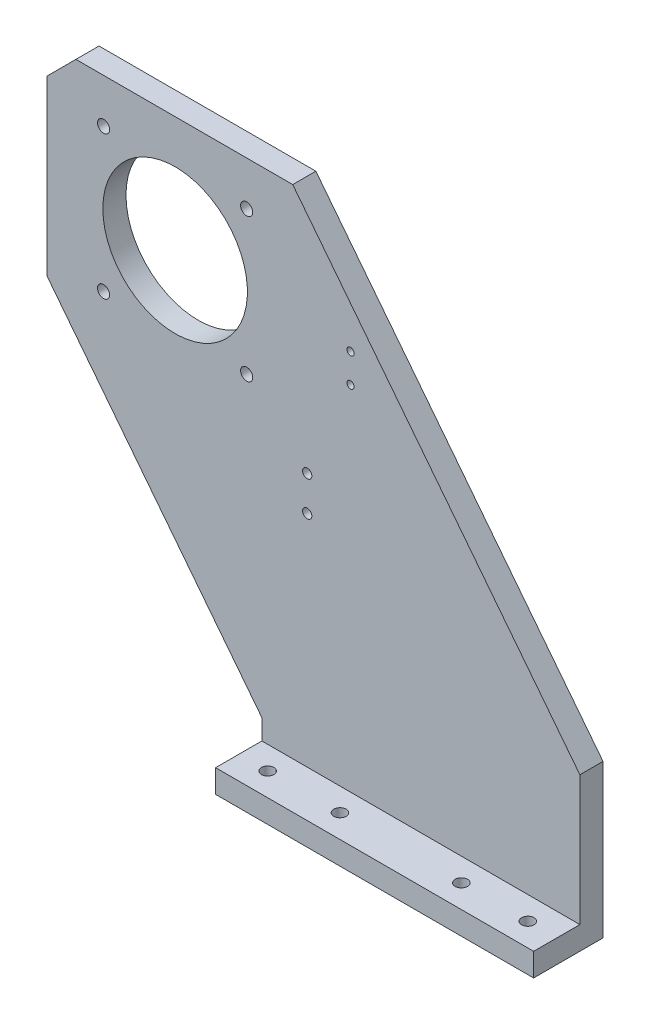
ISO-10303-21;
HEADER;
FILE_DESCRIPTION(('STEP AP214'),'2;1');
FILE_NAME('part.step','',(''),(''),'','','');
FILE_SCHEMA(('AUTOMOTIVE_DESIGN { 1 0 10303 214 1 1 1 1 }'));
ENDSEC;
DATA;
#1=APPLICATION_CONTEXT('core data for automotive mechanical design processes');
#2=APPLICATION_PROTOCOL_DEFINITION('international standard','automotive_design',2000,#1);
#3=PRODUCT_CONTEXT('',#1,'mechanical');
#4=PRODUCT('Part','Part','',(#3));
#5=PRODUCT_RELATED_PRODUCT_CATEGORY('part','',(#4));
#6=PRODUCT_DEFINITION_FORMATION('','',#4);
#7=PRODUCT_DEFINITION_CONTEXT('part definition',#1,'design');
#8=PRODUCT_DEFINITION('design','',#6,#7);
#9=PRODUCT_DEFINITION_SHAPE('','',#8);
#10=(LENGTH_UNIT() NAMED_UNIT(*) SI_UNIT(.MILLI.,.METRE.));
#11=(NAMED_UNIT(*) PLANE_ANGLE_UNIT() SI_UNIT($,.RADIAN.));
#12=(NAMED_UNIT(*) SI_UNIT($,.STERADIAN.) SOLID_ANGLE_UNIT());
#13=UNCERTAINTY_MEASURE_WITH_UNIT(LENGTH_MEASURE(1.E-05),#10,'distance_accuracy_value','');
#14=(GEOMETRIC_REPRESENTATION_CONTEXT(3) GLOBAL_UNCERTAINTY_ASSIGNED_CONTEXT((#13)) GLOBAL_UNIT_ASSIGNED_CONTEXT((#10,
#11,#12)) REPRESENTATION_CONTEXT('',''));
#15=CARTESIAN_POINT('',(0.,0.,0.));
#16=DIRECTION('',(0.,0.,1.));
#17=DIRECTION('',(1.,0.,0.));
#18=AXIS2_PLACEMENT_3D('',#15,#16,#17);
#19=CARTESIAN_POINT('',(35.,0.,16.));
#20=DIRECTION('',(0.,1.,0.));
#21=DIRECTION('',(0.,0.,1.));
#22=AXIS2_PLACEMENT_3D('',#19,#20,#21);
#23=CYLINDRICAL_SURFACE('',#22,2.15);
#24=CARTESIAN_POINT('',(35.,0.,16.));
#25=DIRECTION('',(0.,1.,0.));
#26=DIRECTION('',(0.,0.,1.));
#27=AXIS2_PLACEMENT_3D('',#24,#25,#26);
#28=CIRCLE('',#27,2.15);
#29=CARTESIAN_POINT('',(35.,0.,18.15));
#30=VERTEX_POINT('',#29);
#31=EDGE_CURVE('E163',#30,#30,#28,.F.);
#32=ORIENTED_EDGE('',*,*,#31,.T.);
#33=EDGE_LOOP('',(#32));
#34=FACE_BOUND('',#33,.T.);
#35=CARTESIAN_POINT('',(35.,8.,16.));
#36=DIRECTION('',(0.,1.,0.));
#37=DIRECTION('',(0.,0.,1.));
#38=AXIS2_PLACEMENT_3D('',#35,#36,#37);
#39=CIRCLE('',#38,2.15);
#40=CARTESIAN_POINT('',(35.,8.,18.15));
#41=VERTEX_POINT('',#40);
#42=EDGE_CURVE('E19',#41,#41,#39,.T.);
#43=ORIENTED_EDGE('',*,*,#42,.T.);
#44=EDGE_LOOP('',(#43));
#45=FACE_BOUND('',#44,.T.);
#46=ADVANCED_FACE('F16',(#34,#45),#23,.F.);
#47=CARTESIAN_POINT('',(100.,0.,16.));
#48=DIRECTION('',(0.,1.,0.));
#49=DIRECTION('',(0.,0.,1.));
#50=AXIS2_PLACEMENT_3D('',#47,#48,#49);
#51=CYLINDRICAL_SURFACE('',#50,2.15);
#52=CARTESIAN_POINT('',(100.,0.,16.));
#53=DIRECTION('',(0.,1.,0.));
#54=DIRECTION('',(0.,0.,1.));
#55=AXIS2_PLACEMENT_3D('',#52,#53,#54);
#56=CIRCLE('',#55,2.15);
#57=CARTESIAN_POINT('',(100.,0.,18.15));
#58=VERTEX_POINT('',#57);
#59=EDGE_CURVE('E160',#58,#58,#56,.F.);
#60=ORIENTED_EDGE('',*,*,#59,.T.);
#61=EDGE_LOOP('',(#60));
#62=FACE_BOUND('',#61,.T.);
#63=CARTESIAN_POINT('',(100.,8.,16.));
#64=DIRECTION('',(0.,1.,0.));
#65=DIRECTION('',(0.,0.,1.));
#66=AXIS2_PLACEMENT_3D('',#63,#64,#65);
#67=CIRCLE('',#66,2.15);
#68=CARTESIAN_POINT('',(100.,8.,18.15));
#69=VERTEX_POINT('',#68);
#70=EDGE_CURVE('E193',#69,#69,#67,.T.);
#71=ORIENTED_EDGE('',*,*,#70,.T.);
#72=EDGE_LOOP('',(#71));
#73=FACE_BOUND('',#72,.T.);
#74=ADVANCED_FACE('F437',(#62,#73),#51,.F.);
#75=CARTESIAN_POINT('',(77.,0.,16.));
#76=DIRECTION('',(0.,1.,0.));
#77=DIRECTION('',(0.,0.,1.));
#78=AXIS2_PLACEMENT_3D('',#75,#76,#77);
#79=CYLINDRICAL_SURFACE('',#78,2.15);
#80=CARTESIAN_POINT('',(77.,0.,16.));
#81=DIRECTION('',(0.,1.,0.));
#82=DIRECTION('',(0.,0.,1.));
#83=AXIS2_PLACEMENT_3D('',#80,#81,#82);
#84=CIRCLE('',#83,2.15);
#85=CARTESIAN_POINT('',(77.,0.,18.15));
#86=VERTEX_POINT('',#85);
#87=EDGE_CURVE('E157',#86,#86,#84,.F.);
#88=ORIENTED_EDGE('',*,*,#87,.T.);
#89=EDGE_LOOP('',(#88));
#90=FACE_BOUND('',#89,.T.);
#91=CARTESIAN_POINT('',(77.,8.,16.));
#92=DIRECTION('',(0.,1.,0.));
#93=DIRECTION('',(0.,0.,1.));
#94=AXIS2_PLACEMENT_3D('',#91,#92,#93);
#95=CIRCLE('',#94,2.15);
#96=CARTESIAN_POINT('',(77.,8.,18.15));
#97=VERTEX_POINT('',#96);
#98=EDGE_CURVE('E191',#97,#97,#95,.T.);
#99=ORIENTED_EDGE('',*,*,#98,.T.);
#100=EDGE_LOOP('',(#99));
#101=FACE_BOUND('',#100,.T.);
#102=ADVANCED_FACE('F428',(#90,#101),#79,.F.);
#103=CARTESIAN_POINT('',(10.,0.,16.));
#104=DIRECTION('',(0.,1.,0.));
#105=DIRECTION('',(0.,0.,1.));
#106=AXIS2_PLACEMENT_3D('',#103,#104,#105);
#107=CYLINDRICAL_SURFACE('',#106,2.15);
#108=CARTESIAN_POINT('',(10.,0.,16.));
#109=DIRECTION('',(0.,1.,0.));
#110=DIRECTION('',(0.,0.,1.));
#111=AXIS2_PLACEMENT_3D('',#108,#109,#110);
#112=CIRCLE('',#111,2.15);
#113=CARTESIAN_POINT('',(10.,0.,18.15));
#114=VERTEX_POINT('',#113);
#115=EDGE_CURVE('E153',#114,#114,#112,.F.);
#116=ORIENTED_EDGE('',*,*,#115,.T.);
#117=EDGE_LOOP('',(#116));
#118=FACE_BOUND('',#117,.T.);
#119=CARTESIAN_POINT('',(10.,8.,16.));
#120=DIRECTION('',(0.,1.,0.));
#121=DIRECTION('',(0.,0.,1.));
#122=AXIS2_PLACEMENT_3D('',#119,#120,#121);
#123=CIRCLE('',#122,2.15);
#124=CARTESIAN_POINT('',(10.,8.,18.15));
#125=VERTEX_POINT('',#124);
#126=EDGE_CURVE('E123',#125,#125,#123,.T.);
#127=ORIENTED_EDGE('',*,*,#126,.T.);
#128=EDGE_LOOP('',(#127));
#129=FACE_BOUND('',#128,.T.);
#130=ADVANCED_FACE('F214',(#118,#129),#107,.F.);
#131=CARTESIAN_POINT('',(0.,0.,24.));
#132=DIRECTION('',(0.,0.,-1.));
#133=DIRECTION('',(-1.,0.,0.));
#134=AXIS2_PLACEMENT_3D('',#131,#132,#133);
#135=PLANE('',#134);
#136=DIRECTION('',(1.,0.,0.));
#137=VECTOR('',#136,1.);
#138=CARTESIAN_POINT('',(0.,0.,24.));
#139=LINE('',#138,#137);
#140=CARTESIAN_POINT('',(0.,0.,24.));
#141=VERTEX_POINT('',#140);
#142=CARTESIAN_POINT('',(110.,0.,24.));
#143=VERTEX_POINT('',#142);
#144=EDGE_CURVE('E521',#141,#143,#139,.T.);
#145=ORIENTED_EDGE('',*,*,#144,.T.);
#146=DIRECTION('',(0.,1.,0.));
#147=VECTOR('',#146,1.);
#148=CARTESIAN_POINT('',(110.,0.,24.));
#149=LINE('',#148,#147);
#150=CARTESIAN_POINT('',(110.,8.,24.));
#151=VERTEX_POINT('',#150);
#152=EDGE_CURVE('E538',#143,#151,#149,.T.);
#153=ORIENTED_EDGE('',*,*,#152,.T.);
#154=DIRECTION('',(1.,0.,0.));
#155=VECTOR('',#154,1.);
#156=CARTESIAN_POINT('',(0.,8.,24.));
#157=LINE('',#156,#155);
#158=CARTESIAN_POINT('',(0.,8.,24.));
#159=VERTEX_POINT('',#158);
#160=EDGE_CURVE('E122',#151,#159,#157,.F.);
#161=ORIENTED_EDGE('',*,*,#160,.T.);
#162=DIRECTION('',(0.,1.,0.));
#163=VECTOR('',#162,1.);
#164=CARTESIAN_POINT('',(0.,15.,24.));
#165=LINE('',#164,#163);
#166=EDGE_CURVE('E166',#159,#141,#165,.F.);
#167=ORIENTED_EDGE('',*,*,#166,.T.);
#168=EDGE_LOOP('',(#145,#153,#161,#167));
#169=FACE_BOUND('',#168,.T.);
#170=ADVANCED_FACE('F203',(#169),#135,.F.);
#171=CARTESIAN_POINT('',(0.,8.,24.));
#172=DIRECTION('',(0.,-1.,0.));
#173=DIRECTION('',(0.,0.,-1.));
#174=AXIS2_PLACEMENT_3D('',#171,#172,#173);
#175=PLANE('',#174);
#176=DIRECTION('',(0.,0.,1.));
#177=VECTOR('',#176,1.);
#178=CARTESIAN_POINT('',(0.,8.,8.));
#179=LINE('',#178,#177);
#180=CARTESIAN_POINT('',(0.,8.,8.));
#181=VERTEX_POINT('',#180);
#182=EDGE_CURVE('E528',#181,#159,#179,.T.);
#183=ORIENTED_EDGE('',*,*,#182,.T.);
#184=ORIENTED_EDGE('',*,*,#160,.F.);
#185=DIRECTION('',(0.,0.,1.));
#186=VECTOR('',#185,1.);
#187=CARTESIAN_POINT('',(110.,8.,8.));
#188=LINE('',#187,#186);
#189=CARTESIAN_POINT('',(110.,8.,8.));
#190=VERTEX_POINT('',#189);
#191=EDGE_CURVE('E534',#151,#190,#188,.F.);
#192=ORIENTED_EDGE('',*,*,#191,.T.);
#193=DIRECTION('',(1.,0.,0.));
#194=VECTOR('',#193,1.);
#195=CARTESIAN_POINT('',(0.,8.,8.));
#196=LINE('',#195,#194);
#197=EDGE_CURVE('E119',#181,#190,#196,.T.);
#198=ORIENTED_EDGE('',*,*,#197,.F.);
#199=EDGE_LOOP('',(#183,#184,#192,#198));
#200=FACE_BOUND('',#199,.T.);
#201=ORIENTED_EDGE('',*,*,#126,.F.);
#202=EDGE_LOOP('',(#201));
#203=FACE_BOUND('',#202,.T.);
#204=ORIENTED_EDGE('',*,*,#98,.F.);
#205=EDGE_LOOP('',(#204));
#206=FACE_BOUND('',#205,.T.);
#207=ORIENTED_EDGE('',*,*,#70,.F.);
#208=EDGE_LOOP('',(#207));
#209=FACE_BOUND('',#208,.T.);
#210=ORIENTED_EDGE('',*,*,#42,.F.);
#211=EDGE_LOOP('',(#210));
#212=FACE_BOUND('',#211,.T.);
#213=ADVANCED_FACE('F201',(#200,#203,#206,#209,#212),#175,.F.);
#214=CARTESIAN_POINT('',(0.,0.,8.));
#215=DIRECTION('',(0.,0.,1.));
#216=DIRECTION('',(1.,0.,0.));
#217=AXIS2_PLACEMENT_3D('',#214,#215,#216);
#218=PLANE('',#217);
#219=CARTESIAN_POINT('',(-30.,140.,8.));
#220=DIRECTION('',(0.,0.,-1.));
#221=DIRECTION('',(-1.,0.,0.));
#222=AXIS2_PLACEMENT_3D('',#219,#220,#221);
#223=CIRCLE('',#222,24.9999999999983);
#224=CARTESIAN_POINT('',(-54.9999999999983,140.,8.));
#225=VERTEX_POINT('',#224);
#226=EDGE_CURVE('E149',#225,#225,#223,.T.);
#227=ORIENTED_EDGE('',*,*,#226,.T.);
#228=EDGE_LOOP('',(#227));
#229=FACE_BOUND('',#228,.T.);
#230=DIRECTION('',(-0.615661475325657,0.788010753606723,0.));
#231=VECTOR('',#230,1.);
#232=CARTESIAN_POINT('',(-74.3201247156244,110.12542173331,8.));
#233=LINE('',#232,#231);
#234=CARTESIAN_POINT('',(-74.3201247156244,110.12542173331,8.));
#235=VERTEX_POINT('',#234);
#236=CARTESIAN_POINT('',(0.,15.,8.));
#237=VERTEX_POINT('',#236);
#238=EDGE_CURVE('E92',#235,#237,#233,.F.);
#239=ORIENTED_EDGE('',*,*,#238,.T.);
#240=DIRECTION('',(0.,1.,0.));
#241=VECTOR('',#240,1.);
#242=CARTESIAN_POINT('',(0.,15.,8.));
#243=LINE('',#242,#241);
#244=EDGE_CURVE('E530',#237,#181,#243,.F.);
#245=ORIENTED_EDGE('',*,*,#244,.T.);
#246=ORIENTED_EDGE('',*,*,#197,.T.);
#247=DIRECTION('',(0.,1.,0.));
#248=VECTOR('',#247,1.);
#249=CARTESIAN_POINT('',(110.,0.,8.));
#250=LINE('',#249,#248);
#251=CARTESIAN_POINT('',(110.,52.8760374618631,8.));
#252=VERTEX_POINT('',#251);
#253=EDGE_CURVE('E537',#190,#252,#250,.T.);
#254=ORIENTED_EDGE('',*,*,#253,.T.);
#255=DIRECTION('',(0.615661475325657,-0.788010753606723,0.));
#256=VECTOR('',#255,1.);
#257=CARTESIAN_POINT('',(110.,52.8760374618631,8.));
#258=LINE('',#257,#256);
#259=CARTESIAN_POINT('',(10.6798752843756,180.,8.));
#260=VERTEX_POINT('',#259);
#261=EDGE_CURVE('E572',#252,#260,#258,.F.);
#262=ORIENTED_EDGE('',*,*,#261,.T.);
#263=DIRECTION('',(1.,0.,0.));
#264=VECTOR('',#263,1.);
#265=CARTESIAN_POINT('',(10.6798752843756,180.,8.));
#266=LINE('',#265,#264);
#267=CARTESIAN_POINT('',(-64.3201247156244,180.,8.));
#268=VERTEX_POINT('',#267);
#269=EDGE_CURVE('E567',#260,#268,#266,.F.);
#270=ORIENTED_EDGE('',*,*,#269,.T.);
#271=DIRECTION('',(0.707106781186548,0.707106781186548,0.));
#272=VECTOR('',#271,1.);
#273=CARTESIAN_POINT('',(-64.3201247156244,180.,8.));
#274=LINE('',#273,#272);
#275=CARTESIAN_POINT('',(-74.3201247156244,170.,8.));
#276=VERTEX_POINT('',#275);
#277=EDGE_CURVE('E98',#268,#276,#274,.F.);
#278=ORIENTED_EDGE('',*,*,#277,.T.);
#279=DIRECTION('',(0.,1.,0.));
#280=VECTOR('',#279,1.);
#281=CARTESIAN_POINT('',(-74.3201247156244,170.,8.));
#282=LINE('',#281,#280);
#283=EDGE_CURVE('E95',#276,#235,#282,.F.);
#284=ORIENTED_EDGE('',*,*,#283,.T.);
#285=EDGE_LOOP('',(#239,#245,#246,#254,#262,#270,#278,#284));
#286=FACE_BOUND('',#285,.T.);
#287=CARTESIAN_POINT('',(-5.25000000000002,115.25,8.));
#288=DIRECTION('',(0.,0.,1.));
#289=DIRECTION('',(1.,0.,0.));
#290=AXIS2_PLACEMENT_3D('',#287,#288,#289);
#291=CIRCLE('',#290,2.09999999999999);
#292=CARTESIAN_POINT('',(-3.15000000000003,115.25,8.));
#293=VERTEX_POINT('',#292);
#294=EDGE_CURVE('E104',#293,#293,#291,.F.);
#295=ORIENTED_EDGE('',*,*,#294,.T.);
#296=EDGE_LOOP('',(#295));
#297=FACE_BOUND('',#296,.T.);
#298=CARTESIAN_POINT('',(-54.75,115.25,8.));
#299=DIRECTION('',(0.,0.,1.));
#300=DIRECTION('',(1.,0.,0.));
#301=AXIS2_PLACEMENT_3D('',#298,#299,#300);
#302=CIRCLE('',#301,2.09999999999999);
#303=CARTESIAN_POINT('',(-52.65,115.25,8.));
#304=VERTEX_POINT('',#303);
#305=EDGE_CURVE('E169',#304,#304,#302,.F.);
#306=ORIENTED_EDGE('',*,*,#305,.T.);
#307=EDGE_LOOP('',(#306));
#308=FACE_BOUND('',#307,.T.);
#309=CARTESIAN_POINT('',(-5.25000000000002,164.75,8.));
#310=DIRECTION('',(0.,0.,1.));
#311=DIRECTION('',(1.,0.,0.));
#312=AXIS2_PLACEMENT_3D('',#309,#310,#311);
#313=CIRCLE('',#312,2.09999999999999);
#314=CARTESIAN_POINT('',(-3.15000000000003,164.75,8.));
#315=VERTEX_POINT('',#314);
#316=EDGE_CURVE('E172',#315,#315,#313,.F.);
#317=ORIENTED_EDGE('',*,*,#316,.T.);
#318=EDGE_LOOP('',(#317));
#319=FACE_BOUND('',#318,.T.);
#320=CARTESIAN_POINT('',(-54.75,164.75,8.));
#321=DIRECTION('',(0.,0.,1.));
#322=DIRECTION('',(1.,0.,0.));
#323=AXIS2_PLACEMENT_3D('',#320,#321,#322);
#324=CIRCLE('',#323,2.09999999999999);
#325=CARTESIAN_POINT('',(-52.65,164.75,8.));
#326=VERTEX_POINT('',#325);
#327=EDGE_CURVE('E175',#326,#326,#324,.F.);
#328=ORIENTED_EDGE('',*,*,#327,.T.);
#329=EDGE_LOOP('',(#328));
#330=FACE_BOUND('',#329,.T.);
#331=CARTESIAN_POINT('',(15.6798752843756,96.,8.));
#332=DIRECTION('',(0.,0.,1.));
#333=DIRECTION('',(1.,0.,0.));
#334=AXIS2_PLACEMENT_3D('',#331,#332,#333);
#335=CIRCLE('',#334,1.60000000000001);
#336=CARTESIAN_POINT('',(17.2798752843756,96.,8.));
#337=VERTEX_POINT('',#336);
#338=EDGE_CURVE('E178',#337,#337,#335,.F.);
#339=ORIENTED_EDGE('',*,*,#338,.T.);
#340=EDGE_LOOP('',(#339));
#341=FACE_BOUND('',#340,.T.);
#342=CARTESIAN_POINT('',(15.6798752843756,84.,8.));
#343=DIRECTION('',(0.,0.,1.));
#344=DIRECTION('',(1.,0.,0.));
#345=AXIS2_PLACEMENT_3D('',#342,#343,#344);
#346=CIRCLE('',#345,1.60000000000001);
#347=CARTESIAN_POINT('',(17.2798752843756,84.,8.));
#348=VERTEX_POINT('',#347);
#349=EDGE_CURVE('E181',#348,#348,#346,.F.);
#350=ORIENTED_EDGE('',*,*,#349,.T.);
#351=EDGE_LOOP('',(#350));
#352=FACE_BOUND('',#351,.T.);
#353=CARTESIAN_POINT('',(30.6798752843756,140.,8.));
#354=DIRECTION('',(0.,0.,1.));
#355=DIRECTION('',(1.,0.,0.));
#356=AXIS2_PLACEMENT_3D('',#353,#354,#355);
#357=CIRCLE('',#356,1.25);
#358=CARTESIAN_POINT('',(31.9298752843756,140.,8.));
#359=VERTEX_POINT('',#358);
#360=EDGE_CURVE('E184',#359,#359,#357,.F.);
#361=ORIENTED_EDGE('',*,*,#360,.T.);
#362=EDGE_LOOP('',(#361));
#363=FACE_BOUND('',#362,.T.);
#364=CARTESIAN_POINT('',(30.6798752843756,130.,8.));
#365=DIRECTION('',(0.,0.,1.));
#366=DIRECTION('',(1.,0.,0.));
#367=AXIS2_PLACEMENT_3D('',#364,#365,#366);
#368=CIRCLE('',#367,1.25);
#369=CARTESIAN_POINT('',(31.9298752843756,130.,8.));
#370=VERTEX_POINT('',#369);
#371=EDGE_CURVE('E121',#370,#370,#368,.F.);
#372=ORIENTED_EDGE('',*,*,#371,.T.);
#373=EDGE_LOOP('',(#372));
#374=FACE_BOUND('',#373,.T.);
#375=ADVANCED_FACE('F96',(#229,#286,#297,#308,#319,#330,#341,#352,#363,#374),#218,.T.);
#376=CARTESIAN_POINT('',(30.6798752843756,130.,8.));
#377=DIRECTION('',(0.,0.,1.));
#378=DIRECTION('',(1.,0.,0.));
#379=AXIS2_PLACEMENT_3D('',#376,#377,#378);
#380=CYLINDRICAL_SURFACE('',#379,1.25);
#381=CARTESIAN_POINT('',(30.6798752843756,130.,0.));
#382=DIRECTION('',(0.,0.,1.));
#383=DIRECTION('',(1.,0.,0.));
#384=AXIS2_PLACEMENT_3D('',#381,#382,#383);
#385=CIRCLE('',#384,1.25);
#386=CARTESIAN_POINT('',(31.9298752843756,130.,0.));
#387=VERTEX_POINT('',#386);
#388=EDGE_CURVE('E146',#387,#387,#385,.F.);
#389=ORIENTED_EDGE('',*,*,#388,.T.);
#390=EDGE_LOOP('',(#389));
#391=FACE_BOUND('',#390,.T.);
#392=ORIENTED_EDGE('',*,*,#371,.F.);
#393=EDGE_LOOP('',(#392));
#394=FACE_BOUND('',#393,.T.);
#395=ADVANCED_FACE('F211',(#391,#394),#380,.F.);
#396=CARTESIAN_POINT('',(30.6798752843756,140.,8.));
#397=DIRECTION('',(0.,0.,1.));
#398=DIRECTION('',(1.,0.,0.));
#399=AXIS2_PLACEMENT_3D('',#396,#397,#398);
#400=CYLINDRICAL_SURFACE('',#399,1.25);
#401=CARTESIAN_POINT('',(30.6798752843756,140.,0.));
#402=DIRECTION('',(0.,0.,1.));
#403=DIRECTION('',(1.,0.,0.));
#404=AXIS2_PLACEMENT_3D('',#401,#402,#403);
#405=CIRCLE('',#404,1.25);
#406=CARTESIAN_POINT('',(31.9298752843756,140.,0.));
#407=VERTEX_POINT('',#406);
#408=EDGE_CURVE('E143',#407,#407,#405,.F.);
#409=ORIENTED_EDGE('',*,*,#408,.T.);
#410=EDGE_LOOP('',(#409));
#411=FACE_BOUND('',#410,.T.);
#412=ORIENTED_EDGE('',*,*,#360,.F.);
#413=EDGE_LOOP('',(#412));
#414=FACE_BOUND('',#413,.T.);
#415=ADVANCED_FACE('F282',(#411,#414),#400,.F.);
#416=CARTESIAN_POINT('',(15.6798752843756,84.,0.));
#417=DIRECTION('',(0.,0.,1.));
#418=DIRECTION('',(1.,0.,0.));
#419=AXIS2_PLACEMENT_3D('',#416,#417,#418);
#420=CYLINDRICAL_SURFACE('',#419,1.60000000000001);
#421=CARTESIAN_POINT('',(15.6798752843756,84.,0.));
#422=DIRECTION('',(0.,0.,1.));
#423=DIRECTION('',(1.,0.,0.));
#424=AXIS2_PLACEMENT_3D('',#421,#422,#423);
#425=CIRCLE('',#424,1.60000000000001);
#426=CARTESIAN_POINT('',(17.2798752843756,84.,0.));
#427=VERTEX_POINT('',#426);
#428=EDGE_CURVE('E140',#427,#427,#425,.F.);
#429=ORIENTED_EDGE('',*,*,#428,.T.);
#430=EDGE_LOOP('',(#429));
#431=FACE_BOUND('',#430,.T.);
#432=ORIENTED_EDGE('',*,*,#349,.F.);
#433=EDGE_LOOP('',(#432));
#434=FACE_BOUND('',#433,.T.);
#435=ADVANCED_FACE('F278',(#431,#434),#420,.F.);
#436=CARTESIAN_POINT('',(15.6798752843756,96.,0.));
#437=DIRECTION('',(0.,0.,1.));
#438=DIRECTION('',(1.,0.,0.));
#439=AXIS2_PLACEMENT_3D('',#436,#437,#438);
#440=CYLINDRICAL_SURFACE('',#439,1.60000000000001);
#441=CARTESIAN_POINT('',(15.6798752843756,96.,0.));
#442=DIRECTION('',(0.,0.,1.));
#443=DIRECTION('',(1.,0.,0.));
#444=AXIS2_PLACEMENT_3D('',#441,#442,#443);
#445=CIRCLE('',#444,1.60000000000001);
#446=CARTESIAN_POINT('',(17.2798752843756,96.,0.));
#447=VERTEX_POINT('',#446);
#448=EDGE_CURVE('E137',#447,#447,#445,.F.);
#449=ORIENTED_EDGE('',*,*,#448,.T.);
#450=EDGE_LOOP('',(#449));
#451=FACE_BOUND('',#450,.T.);
#452=ORIENTED_EDGE('',*,*,#338,.F.);
#453=EDGE_LOOP('',(#452));
#454=FACE_BOUND('',#453,.T.);
#455=ADVANCED_FACE('F274',(#451,#454),#440,.F.);
#456=CARTESIAN_POINT('',(-54.75,164.75,8.));
#457=DIRECTION('',(0.,0.,1.));
#458=DIRECTION('',(1.,0.,0.));
#459=AXIS2_PLACEMENT_3D('',#456,#457,#458);
#460=CYLINDRICAL_SURFACE('',#459,2.09999999999999);
#461=CARTESIAN_POINT('',(-54.75,164.75,0.));
#462=DIRECTION('',(0.,0.,1.));
#463=DIRECTION('',(1.,0.,0.));
#464=AXIS2_PLACEMENT_3D('',#461,#462,#463);
#465=CIRCLE('',#464,2.09999999999999);
#466=CARTESIAN_POINT('',(-52.65,164.75,0.));
#467=VERTEX_POINT('',#466);
#468=EDGE_CURVE('E134',#467,#467,#465,.F.);
#469=ORIENTED_EDGE('',*,*,#468,.T.);
#470=EDGE_LOOP('',(#469));
#471=FACE_BOUND('',#470,.T.);
#472=ORIENTED_EDGE('',*,*,#327,.F.);
#473=EDGE_LOOP('',(#472));
#474=FACE_BOUND('',#473,.T.);
#475=ADVANCED_FACE('F270',(#471,#474),#460,.F.);
#476=CARTESIAN_POINT('',(-5.25000000000002,164.75,8.));
#477=DIRECTION('',(0.,0.,1.));
#478=DIRECTION('',(1.,0.,0.));
#479=AXIS2_PLACEMENT_3D('',#476,#477,#478);
#480=CYLINDRICAL_SURFACE('',#479,2.09999999999999);
#481=CARTESIAN_POINT('',(-5.25000000000002,164.75,0.));
#482=DIRECTION('',(0.,0.,1.));
#483=DIRECTION('',(1.,0.,0.));
#484=AXIS2_PLACEMENT_3D('',#481,#482,#483);
#485=CIRCLE('',#484,2.09999999999999);
#486=CARTESIAN_POINT('',(-3.15000000000003,164.75,0.));
#487=VERTEX_POINT('',#486);
#488=EDGE_CURVE('E131',#487,#487,#485,.F.);
#489=ORIENTED_EDGE('',*,*,#488,.T.);
#490=EDGE_LOOP('',(#489));
#491=FACE_BOUND('',#490,.T.);
#492=ORIENTED_EDGE('',*,*,#316,.F.);
#493=EDGE_LOOP('',(#492));
#494=FACE_BOUND('',#493,.T.);
#495=ADVANCED_FACE('F266',(#491,#494),#480,.F.);
#496=CARTESIAN_POINT('',(-54.75,115.25,8.));
#497=DIRECTION('',(0.,0.,1.));
#498=DIRECTION('',(1.,0.,0.));
#499=AXIS2_PLACEMENT_3D('',#496,#497,#498);
#500=CYLINDRICAL_SURFACE('',#499,2.09999999999999);
#501=CARTESIAN_POINT('',(-54.75,115.25,0.));
#502=DIRECTION('',(0.,0.,1.));
#503=DIRECTION('',(1.,0.,0.));
#504=AXIS2_PLACEMENT_3D('',#501,#502,#503);
#505=CIRCLE('',#504,2.09999999999999);
#506=CARTESIAN_POINT('',(-52.65,115.25,0.));
#507=VERTEX_POINT('',#506);
#508=EDGE_CURVE('E128',#507,#507,#505,.F.);
#509=ORIENTED_EDGE('',*,*,#508,.T.);
#510=EDGE_LOOP('',(#509));
#511=FACE_BOUND('',#510,.T.);
#512=ORIENTED_EDGE('',*,*,#305,.F.);
#513=EDGE_LOOP('',(#512));
#514=FACE_BOUND('',#513,.T.);
#515=ADVANCED_FACE('F262',(#511,#514),#500,.F.);
#516=CARTESIAN_POINT('',(-5.25000000000002,115.25,8.));
#517=DIRECTION('',(0.,0.,1.));
#518=DIRECTION('',(1.,0.,0.));
#519=AXIS2_PLACEMENT_3D('',#516,#517,#518);
#520=CYLINDRICAL_SURFACE('',#519,2.09999999999999);
#521=CARTESIAN_POINT('',(-5.25000000000002,115.25,0.));
#522=DIRECTION('',(0.,0.,1.));
#523=DIRECTION('',(1.,0.,0.));
#524=AXIS2_PLACEMENT_3D('',#521,#522,#523);
#525=CIRCLE('',#524,2.09999999999999);
#526=CARTESIAN_POINT('',(-3.15000000000003,115.25,0.));
#527=VERTEX_POINT('',#526);
#528=EDGE_CURVE('E125',#527,#527,#525,.F.);
#529=ORIENTED_EDGE('',*,*,#528,.T.);
#530=EDGE_LOOP('',(#529));
#531=FACE_BOUND('',#530,.T.);
#532=ORIENTED_EDGE('',*,*,#294,.F.);
#533=EDGE_LOOP('',(#532));
#534=FACE_BOUND('',#533,.T.);
#535=ADVANCED_FACE('F259',(#531,#534),#520,.F.);
#536=CARTESIAN_POINT('',(-74.3201247156244,170.,8.));
#537=DIRECTION('',(1.,0.,0.));
#538=DIRECTION('',(0.,1.,0.));
#539=AXIS2_PLACEMENT_3D('',#536,#537,#538);
#540=PLANE('',#539);
#541=DIRECTION('',(0.,0.,1.));
#542=VECTOR('',#541,1.);
#543=CARTESIAN_POINT('',(-74.3201247156244,110.12542173331,8.));
#544=LINE('',#543,#542);
#545=CARTESIAN_POINT('',(-74.3201247156244,110.12542173331,0.));
#546=VERTEX_POINT('',#545);
#547=EDGE_CURVE('E103',#546,#235,#544,.T.);
#548=ORIENTED_EDGE('',*,*,#547,.T.);
#549=ORIENTED_EDGE('',*,*,#283,.F.);
#550=DIRECTION('',(0.,0.,1.));
#551=VECTOR('',#550,1.);
#552=CARTESIAN_POINT('',(-74.3201247156244,170.,8.));
#553=LINE('',#552,#551);
#554=CARTESIAN_POINT('',(-74.3201247156244,170.,0.));
#555=VERTEX_POINT('',#554);
#556=EDGE_CURVE('E152',#276,#555,#553,.F.);
#557=ORIENTED_EDGE('',*,*,#556,.T.);
#558=DIRECTION('',(0.,1.,0.));
#559=VECTOR('',#558,1.);
#560=CARTESIAN_POINT('',(-74.3201247156244,0.,0.));
#561=LINE('',#560,#559);
#562=EDGE_CURVE('E115',#555,#546,#561,.F.);
#563=ORIENTED_EDGE('',*,*,#562,.T.);
#564=EDGE_LOOP('',(#548,#549,#557,#563));
#565=FACE_BOUND('',#564,.T.);
#566=ADVANCED_FACE('F114',(#565),#540,.F.);
#567=CARTESIAN_POINT('',(-74.3201247156244,110.12542173331,8.));
#568=DIRECTION('',(0.788010753606723,0.615661475325657,0.));
#569=DIRECTION('',(-0.615661475325657,0.788010753606723,0.));
#570=AXIS2_PLACEMENT_3D('',#567,#568,#569);
#571=PLANE('',#570);
#572=DIRECTION('',(0.,0.,1.));
#573=VECTOR('',#572,1.);
#574=CARTESIAN_POINT('',(0.,15.,8.));
#575=LINE('',#574,#573);
#576=CARTESIAN_POINT('',(0.,15.,0.));
#577=VERTEX_POINT('',#576);
#578=EDGE_CURVE('E111',#577,#237,#575,.T.);
#579=ORIENTED_EDGE('',*,*,#578,.T.);
#580=ORIENTED_EDGE('',*,*,#238,.F.);
#581=ORIENTED_EDGE('',*,*,#547,.F.);
#582=DIRECTION('',(0.615661475325657,-0.788010753606723,0.));
#583=VECTOR('',#582,1.);
#584=CARTESIAN_POINT('',(-74.3201247156244,110.12542173331,0.));
#585=LINE('',#584,#583);
#586=EDGE_CURVE('E561',#546,#577,#585,.T.);
#587=ORIENTED_EDGE('',*,*,#586,.T.);
#588=EDGE_LOOP('',(#579,#580,#581,#587));
#589=FACE_BOUND('',#588,.T.);
#590=ADVANCED_FACE('F108',(#589),#571,.F.);
#591=CARTESIAN_POINT('',(0.,15.,8.));
#592=DIRECTION('',(1.,0.,0.));
#593=DIRECTION('',(0.,1.,0.));
#594=AXIS2_PLACEMENT_3D('',#591,#592,#593);
#595=PLANE('',#594);
#596=DIRECTION('',(0.,0.,1.));
#597=VECTOR('',#596,1.);
#598=CARTESIAN_POINT('',(0.,0.,8.));
#599=LINE('',#598,#597);
#600=CARTESIAN_POINT('',(0.,0.,0.));
#601=VERTEX_POINT('',#600);
#602=EDGE_CURVE('E156',#601,#141,#599,.T.);
#603=ORIENTED_EDGE('',*,*,#602,.T.);
#604=ORIENTED_EDGE('',*,*,#166,.F.);
#605=ORIENTED_EDGE('',*,*,#182,.F.);
#606=ORIENTED_EDGE('',*,*,#244,.F.);
#607=ORIENTED_EDGE('',*,*,#578,.F.);
#608=DIRECTION('',(0.,1.,0.));
#609=VECTOR('',#608,1.);
#610=CARTESIAN_POINT('',(0.,0.,0.));
#611=LINE('',#610,#609);
#612=EDGE_CURVE('E517',#577,#601,#611,.F.);
#613=ORIENTED_EDGE('',*,*,#612,.T.);
#614=EDGE_LOOP('',(#603,#604,#605,#606,#607,#613));
#615=FACE_BOUND('',#614,.T.);
#616=ADVANCED_FACE('F250',(#615),#595,.F.);
#617=CARTESIAN_POINT('',(0.,0.,8.));
#618=DIRECTION('',(0.,1.,0.));
#619=DIRECTION('',(0.,0.,1.));
#620=AXIS2_PLACEMENT_3D('',#617,#618,#619);
#621=PLANE('',#620);
#622=DIRECTION('',(0.,0.,1.));
#623=VECTOR('',#622,1.);
#624=CARTESIAN_POINT('',(110.,0.,8.));
#625=LINE('',#624,#623);
#626=CARTESIAN_POINT('',(110.,0.,0.));
#627=VERTEX_POINT('',#626);
#628=EDGE_CURVE('E523',#627,#143,#625,.T.);
#629=ORIENTED_EDGE('',*,*,#628,.T.);
#630=ORIENTED_EDGE('',*,*,#144,.F.);
#631=ORIENTED_EDGE('',*,*,#602,.F.);
#632=DIRECTION('',(1.,0.,0.));
#633=VECTOR('',#632,1.);
#634=CARTESIAN_POINT('',(0.,0.,0.));
#635=LINE('',#634,#633);
#636=EDGE_CURVE('E545',#601,#627,#635,.T.);
#637=ORIENTED_EDGE('',*,*,#636,.T.);
#638=EDGE_LOOP('',(#629,#630,#631,#637));
#639=FACE_BOUND('',#638,.T.);
#640=ORIENTED_EDGE('',*,*,#115,.F.);
#641=EDGE_LOOP('',(#640));
#642=FACE_BOUND('',#641,.T.);
#643=ORIENTED_EDGE('',*,*,#87,.F.);
#644=EDGE_LOOP('',(#643));
#645=FACE_BOUND('',#644,.T.);
#646=ORIENTED_EDGE('',*,*,#59,.F.);
#647=EDGE_LOOP('',(#646));
#648=FACE_BOUND('',#647,.T.);
#649=ORIENTED_EDGE('',*,*,#31,.F.);
#650=EDGE_LOOP('',(#649));
#651=FACE_BOUND('',#650,.T.);
#652=ADVANCED_FACE('F246',(#639,#642,#645,#648,#651),#621,.F.);
#653=CARTESIAN_POINT('',(110.,0.,8.));
#654=DIRECTION('',(-1.,0.,0.));
#655=DIRECTION('',(0.,0.,1.));
#656=AXIS2_PLACEMENT_3D('',#653,#654,#655);
#657=PLANE('',#656);
#658=DIRECTION('',(0.,0.,1.));
#659=VECTOR('',#658,1.);
#660=CARTESIAN_POINT('',(110.,52.8760374618631,8.));
#661=LINE('',#660,#659);
#662=CARTESIAN_POINT('',(110.,52.8760374618631,0.));
#663=VERTEX_POINT('',#662);
#664=EDGE_CURVE('E540',#663,#252,#661,.T.);
#665=ORIENTED_EDGE('',*,*,#664,.T.);
#666=ORIENTED_EDGE('',*,*,#253,.F.);
#667=ORIENTED_EDGE('',*,*,#191,.F.);
#668=ORIENTED_EDGE('',*,*,#152,.F.);
#669=ORIENTED_EDGE('',*,*,#628,.F.);
#670=DIRECTION('',(0.,1.,0.));
#671=VECTOR('',#670,1.);
#672=CARTESIAN_POINT('',(110.,0.,0.));
#673=LINE('',#672,#671);
#674=EDGE_CURVE('E549',#627,#663,#673,.T.);
#675=ORIENTED_EDGE('',*,*,#674,.T.);
#676=EDGE_LOOP('',(#665,#666,#667,#668,#669,#675));
#677=FACE_BOUND('',#676,.T.);
#678=ADVANCED_FACE('F242',(#677),#657,.F.);
#679=CARTESIAN_POINT('',(110.,52.8760374618631,8.));
#680=DIRECTION('',(-0.788010753606723,-0.615661475325657,0.));
#681=DIRECTION('',(0.615661475325657,-0.788010753606723,0.));
#682=AXIS2_PLACEMENT_3D('',#679,#680,#681);
#683=PLANE('',#682);
#684=DIRECTION('',(0.,0.,1.));
#685=VECTOR('',#684,1.);
#686=CARTESIAN_POINT('',(10.6798752843756,180.,8.));
#687=LINE('',#686,#685);
#688=CARTESIAN_POINT('',(10.6798752843756,180.,0.));
#689=VERTEX_POINT('',#688);
#690=EDGE_CURVE('E569',#689,#260,#687,.T.);
#691=ORIENTED_EDGE('',*,*,#690,.T.);
#692=ORIENTED_EDGE('',*,*,#261,.F.);
#693=ORIENTED_EDGE('',*,*,#664,.F.);
#694=DIRECTION('',(-0.615661475325657,0.788010753606723,0.));
#695=VECTOR('',#694,1.);
#696=CARTESIAN_POINT('',(110.,52.8760374618631,0.));
#697=LINE('',#696,#695);
#698=EDGE_CURVE('E553',#663,#689,#697,.T.);
#699=ORIENTED_EDGE('',*,*,#698,.T.);
#700=EDGE_LOOP('',(#691,#692,#693,#699));
#701=FACE_BOUND('',#700,.T.);
#702=ADVANCED_FACE('F238',(#701),#683,.F.);
#703=CARTESIAN_POINT('',(10.6798752843756,180.,8.));
#704=DIRECTION('',(0.,-1.,0.));
#705=DIRECTION('',(1.,0.,0.));
#706=AXIS2_PLACEMENT_3D('',#703,#704,#705);
#707=PLANE('',#706);
#708=DIRECTION('',(0.,0.,1.));
#709=VECTOR('',#708,1.);
#710=CARTESIAN_POINT('',(-64.3201247156244,180.,8.));
#711=LINE('',#710,#709);
#712=CARTESIAN_POINT('',(-64.3201247156244,180.,0.));
#713=VERTEX_POINT('',#712);
#714=EDGE_CURVE('E34',#713,#268,#711,.T.);
#715=ORIENTED_EDGE('',*,*,#714,.T.);
#716=ORIENTED_EDGE('',*,*,#269,.F.);
#717=ORIENTED_EDGE('',*,*,#690,.F.);
#718=DIRECTION('',(1.,0.,0.));
#719=VECTOR('',#718,1.);
#720=CARTESIAN_POINT('',(0.,180.,0.));
#721=LINE('',#720,#719);
#722=EDGE_CURVE('E555',#689,#713,#721,.F.);
#723=ORIENTED_EDGE('',*,*,#722,.T.);
#724=EDGE_LOOP('',(#715,#716,#717,#723));
#725=FACE_BOUND('',#724,.T.);
#726=ADVANCED_FACE('F235',(#725),#707,.F.);
#727=CARTESIAN_POINT('',(-64.3201247156244,180.,8.));
#728=DIRECTION('',(0.707106781186548,-0.707106781186548,0.));
#729=DIRECTION('',(0.707106781186548,0.707106781186548,0.));
#730=AXIS2_PLACEMENT_3D('',#727,#728,#729);
#731=PLANE('',#730);
#732=ORIENTED_EDGE('',*,*,#556,.F.);
#733=ORIENTED_EDGE('',*,*,#277,.F.);
#734=ORIENTED_EDGE('',*,*,#714,.F.);
#735=DIRECTION('',(-0.707106781186547,-0.707106781186547,0.));
#736=VECTOR('',#735,1.);
#737=CARTESIAN_POINT('',(-64.3201247156244,180.,0.));
#738=LINE('',#737,#736);
#739=EDGE_CURVE('E25',#713,#555,#738,.T.);
#740=ORIENTED_EDGE('',*,*,#739,.T.);
#741=EDGE_LOOP('',(#732,#733,#734,#740));
#742=FACE_BOUND('',#741,.T.);
#743=ADVANCED_FACE('F227',(#742),#731,.F.);
#744=CARTESIAN_POINT('',(-30.,140.,8.));
#745=DIRECTION('',(0.,0.,-1.));
#746=DIRECTION('',(-1.,0.,0.));
#747=AXIS2_PLACEMENT_3D('',#744,#745,#746);
#748=CYLINDRICAL_SURFACE('',#747,24.9999999999983);
#749=CARTESIAN_POINT('',(-30.,140.,0.));
#750=DIRECTION('',(0.,0.,-1.));
#751=DIRECTION('',(-1.,0.,0.));
#752=AXIS2_PLACEMENT_3D('',#749,#750,#751);
#753=CIRCLE('',#752,24.9999999999983);
#754=CARTESIAN_POINT('',(-54.9999999999983,140.,0.));
#755=VERTEX_POINT('',#754);
#756=EDGE_CURVE('E11',#755,#755,#753,.T.);
#757=ORIENTED_EDGE('',*,*,#756,.T.);
#758=EDGE_LOOP('',(#757));
#759=FACE_BOUND('',#758,.T.);
#760=ORIENTED_EDGE('',*,*,#226,.F.);
#761=EDGE_LOOP('',(#760));
#762=FACE_BOUND('',#761,.T.);
#763=ADVANCED_FACE('F221',(#759,#762),#748,.F.);
#764=CARTESIAN_POINT('',(0.,0.,0.));
#765=DIRECTION('',(0.,0.,1.));
#766=DIRECTION('',(1.,0.,0.));
#767=AXIS2_PLACEMENT_3D('',#764,#765,#766);
#768=PLANE('',#767);
#769=ORIENTED_EDGE('',*,*,#756,.F.);
#770=EDGE_LOOP('',(#769));
#771=FACE_BOUND('',#770,.T.);
#772=ORIENTED_EDGE('',*,*,#722,.F.);
#773=ORIENTED_EDGE('',*,*,#698,.F.);
#774=ORIENTED_EDGE('',*,*,#674,.F.);
#775=ORIENTED_EDGE('',*,*,#636,.F.);
#776=ORIENTED_EDGE('',*,*,#612,.F.);
#777=ORIENTED_EDGE('',*,*,#586,.F.);
#778=ORIENTED_EDGE('',*,*,#562,.F.);
#779=ORIENTED_EDGE('',*,*,#739,.F.);
#780=EDGE_LOOP('',(#772,#773,#774,#775,#776,#777,#778,#779));
#781=FACE_BOUND('',#780,.T.);
#782=ORIENTED_EDGE('',*,*,#528,.F.);
#783=EDGE_LOOP('',(#782));
#784=FACE_BOUND('',#783,.T.);
#785=ORIENTED_EDGE('',*,*,#508,.F.);
#786=EDGE_LOOP('',(#785));
#787=FACE_BOUND('',#786,.T.);
#788=ORIENTED_EDGE('',*,*,#488,.F.);
#789=EDGE_LOOP('',(#788));
#790=FACE_BOUND('',#789,.T.);
#791=ORIENTED_EDGE('',*,*,#468,.F.);
#792=EDGE_LOOP('',(#791));
#793=FACE_BOUND('',#792,.T.);
#794=ORIENTED_EDGE('',*,*,#448,.F.);
#795=EDGE_LOOP('',(#794));
#796=FACE_BOUND('',#795,.T.);
#797=ORIENTED_EDGE('',*,*,#428,.F.);
#798=EDGE_LOOP('',(#797));
#799=FACE_BOUND('',#798,.T.);
#800=ORIENTED_EDGE('',*,*,#408,.F.);
#801=EDGE_LOOP('',(#800));
#802=FACE_BOUND('',#801,.T.);
#803=ORIENTED_EDGE('',*,*,#388,.F.);
#804=EDGE_LOOP('',(#803));
#805=FACE_BOUND('',#804,.T.);
#806=ADVANCED_FACE('F219',(#771,#781,#784,#787,#790,#793,#796,#799,#802,#805),#768,.F.);
#807=CLOSED_SHELL('',(#46,#74,#102,#130,#170,#213,#375,#395,#415,#435,#455,#475,#495,#515,#535,
#566,#590,#616,#652,#678,#702,#726,#743,#763,#806));
#808=MANIFOLD_SOLID_BREP('B1',#807);
#809=ADVANCED_BREP_SHAPE_REPRESENTATION('',(#18,#808),#14);
#810=SHAPE_DEFINITION_REPRESENTATION(#9,#809);
ENDSEC;
END-ISO-10303-21;
